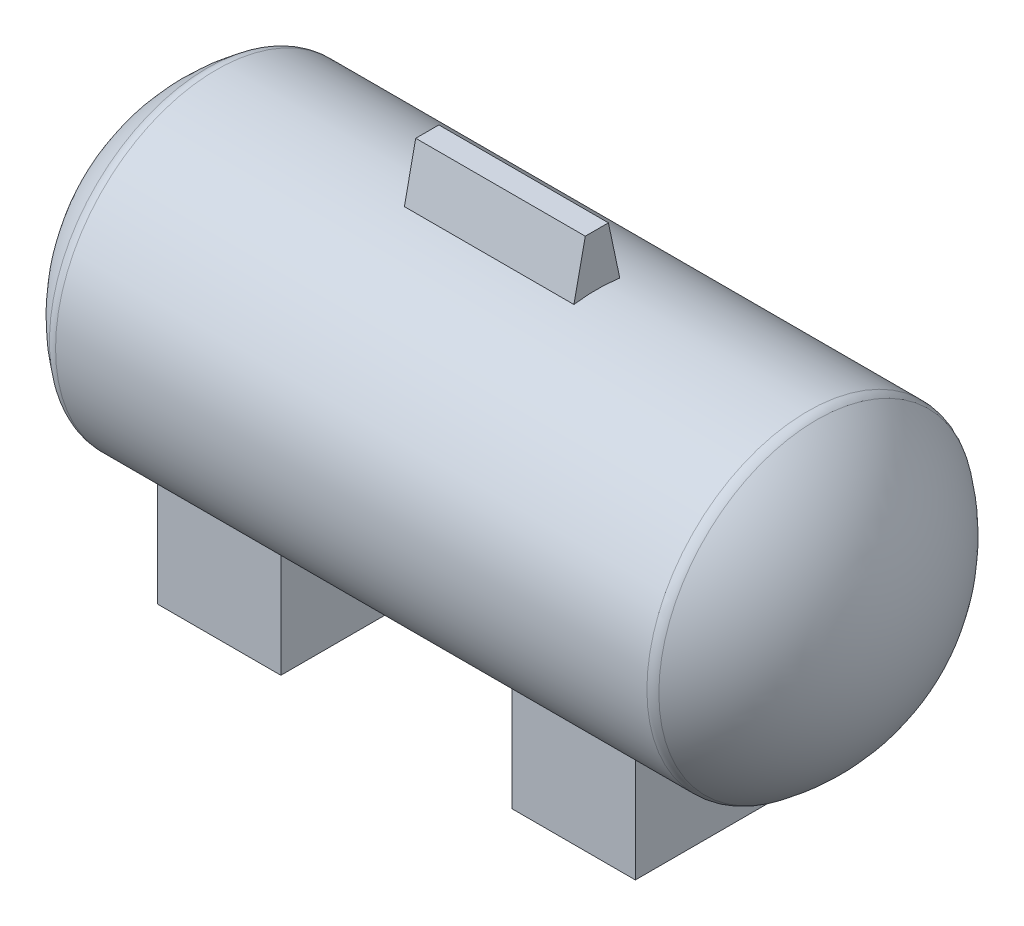
ISO-10303-21;
HEADER;
FILE_DESCRIPTION(('STEP AP214'),'2;1');
FILE_NAME('part.step','',(''),(''),'','','');
FILE_SCHEMA(('AUTOMOTIVE_DESIGN { 1 0 10303 214 1 1 1 1 }'));
ENDSEC;
DATA;
#1=APPLICATION_CONTEXT('core data for automotive mechanical design processes');
#2=APPLICATION_PROTOCOL_DEFINITION('international standard','automotive_design',2000,#1);
#3=PRODUCT_CONTEXT('',#1,'mechanical');
#4=PRODUCT('Part','Part','',(#3));
#5=PRODUCT_RELATED_PRODUCT_CATEGORY('part','',(#4));
#6=PRODUCT_DEFINITION_FORMATION('','',#4);
#7=PRODUCT_DEFINITION_CONTEXT('part definition',#1,'design');
#8=PRODUCT_DEFINITION('design','',#6,#7);
#9=PRODUCT_DEFINITION_SHAPE('','',#8);
#10=(LENGTH_UNIT() NAMED_UNIT(*) SI_UNIT(.MILLI.,.METRE.));
#11=(NAMED_UNIT(*) PLANE_ANGLE_UNIT() SI_UNIT($,.RADIAN.));
#12=(NAMED_UNIT(*) SI_UNIT($,.STERADIAN.) SOLID_ANGLE_UNIT());
#13=UNCERTAINTY_MEASURE_WITH_UNIT(LENGTH_MEASURE(1.E-05),#10,'distance_accuracy_value','');
#14=(GEOMETRIC_REPRESENTATION_CONTEXT(3) GLOBAL_UNCERTAINTY_ASSIGNED_CONTEXT((#13)) GLOBAL_UNIT_ASSIGNED_CONTEXT((#10,
#11,#12)) REPRESENTATION_CONTEXT('',''));
#15=CARTESIAN_POINT('',(0.,0.,0.));
#16=DIRECTION('',(0.,0.,1.));
#17=DIRECTION('',(1.,0.,0.));
#18=AXIS2_PLACEMENT_3D('',#15,#16,#17);
#19=CARTESIAN_POINT('',(-12.3499999999074,0.,0.));
#20=DIRECTION('',(-1.,0.,0.));
#21=DIRECTION('',(0.,1.,0.));
#22=AXIS2_PLACEMENT_3D('',#19,#20,#21);
#23=SPHERICAL_SURFACE('',#22,12.6500000000925);
#24=CARTESIAN_POINT('',(-19.7698130996348,0.,0.));
#25=DIRECTION('',(1.,0.,0.));
#26=DIRECTION('',(0.,0.,-1.));
#27=AXIS2_PLACEMENT_3D('',#24,#25,#26);
#28=CIRCLE('',#27,10.2454318389932);
#29=CARTESIAN_POINT('',(-19.7698130996348,0.,-10.2454318389932));
#30=VERTEX_POINT('',#29);
#31=EDGE_CURVE('E231',#30,#30,#28,.F.);
#32=ORIENTED_EDGE('',*,*,#31,.T.);
#33=EDGE_LOOP('',(#32));
#34=FACE_BOUND('',#33,.T.);
#35=ADVANCED_FACE('F33',(#34),#23,.T.);
#36=CARTESIAN_POINT('',(12.3499999999074,0.,0.));
#37=DIRECTION('',(-1.,0.,0.));
#38=DIRECTION('',(0.,1.,0.));
#39=AXIS2_PLACEMENT_3D('',#36,#37,#38);
#40=SPHERICAL_SURFACE('',#39,12.6500000000925);
#41=CARTESIAN_POINT('',(19.7698130996348,0.,0.));
#42=DIRECTION('',(-1.,0.,0.));
#43=DIRECTION('',(0.,0.,1.));
#44=AXIS2_PLACEMENT_3D('',#41,#42,#43);
#45=CIRCLE('',#44,10.2454318389932);
#46=CARTESIAN_POINT('',(19.7698130996348,0.,10.2454318389932));
#47=VERTEX_POINT('',#46);
#48=EDGE_CURVE('E240',#47,#47,#45,.F.);
#49=ORIENTED_EDGE('',*,*,#48,.T.);
#50=EDGE_LOOP('',(#49));
#51=FACE_BOUND('',#50,.T.);
#52=ADVANCED_FACE('F261',(#51),#40,.T.);
#53=CARTESIAN_POINT('',(-19.5,0.,0.));
#54=DIRECTION('',(-1.,0.,0.));
#55=DIRECTION('',(0.,0.,1.));
#56=AXIS2_PLACEMENT_3D('',#53,#54,#55);
#57=CYLINDRICAL_SURFACE('',#56,10.4355162786044);
#58=DIRECTION('',(-1.,0.,0.));
#59=VECTOR('',#58,1.);
#60=CARTESIAN_POINT('',(-19.5,10.3289421958644,-1.48759978337881));
#61=LINE('',#60,#59);
#62=CARTESIAN_POINT('',(5.5,10.3289421958644,-1.48759978337881));
#63=VERTEX_POINT('',#62);
#64=CARTESIAN_POINT('',(-5.5,10.3289421958644,-1.48759978337881));
#65=VERTEX_POINT('',#64);
#66=EDGE_CURVE('E51',#63,#65,#61,.T.);
#67=ORIENTED_EDGE('',*,*,#66,.F.);
#68=CARTESIAN_POINT('',(5.5,0.,0.));
#69=DIRECTION('',(1.,0.,0.));
#70=DIRECTION('',(0.,0.,-1.));
#71=AXIS2_PLACEMENT_3D('',#68,#69,#70);
#72=CIRCLE('',#71,10.4355162786044);
#73=CARTESIAN_POINT('',(5.5,10.3289421958644,1.48759978337881));
#74=VERTEX_POINT('',#73);
#75=EDGE_CURVE('E11',#63,#74,#72,.T.);
#76=ORIENTED_EDGE('',*,*,#75,.T.);
#77=DIRECTION('',(-1.,0.,0.));
#78=VECTOR('',#77,1.);
#79=CARTESIAN_POINT('',(-19.5,10.3289421958644,1.48759978337881));
#80=LINE('',#79,#78);
#81=CARTESIAN_POINT('',(-5.5,10.3289421958644,1.48759978337881));
#82=VERTEX_POINT('',#81);
#83=EDGE_CURVE('E41',#82,#74,#80,.F.);
#84=ORIENTED_EDGE('',*,*,#83,.F.);
#85=CARTESIAN_POINT('',(-5.5,0.,0.));
#86=DIRECTION('',(1.,0.,0.));
#87=DIRECTION('',(0.,0.,-1.));
#88=AXIS2_PLACEMENT_3D('',#85,#86,#87);
#89=CIRCLE('',#88,10.4355162786044);
#90=EDGE_CURVE('E243',#65,#82,#89,.T.);
#91=ORIENTED_EDGE('',*,*,#90,.F.);
#92=EDGE_LOOP('',(#67,#76,#84,#91));
#93=FACE_BOUND('',#92,.T.);
#94=CARTESIAN_POINT('',(-19.1832666095421,0.,0.));
#95=DIRECTION('',(1.,0.,0.));
#96=DIRECTION('',(0.,0.,-1.));
#97=AXIS2_PLACEMENT_3D('',#94,#95,#96);
#98=CIRCLE('',#97,10.4355162786044);
#99=CARTESIAN_POINT('',(-19.1832666095421,0.,-10.4355162786044));
#100=VERTEX_POINT('',#99);
#101=EDGE_CURVE('E237',#100,#100,#98,.T.);
#102=ORIENTED_EDGE('',*,*,#101,.T.);
#103=EDGE_LOOP('',(#102));
#104=FACE_BOUND('',#103,.T.);
#105=CARTESIAN_POINT('',(19.1832666095421,0.,0.));
#106=DIRECTION('',(-1.,0.,0.));
#107=DIRECTION('',(0.,0.,1.));
#108=AXIS2_PLACEMENT_3D('',#105,#106,#107);
#109=CIRCLE('',#108,10.4355162786044);
#110=CARTESIAN_POINT('',(19.1832666095421,0.,10.4355162786044));
#111=VERTEX_POINT('',#110);
#112=EDGE_CURVE('E234',#111,#111,#109,.T.);
#113=ORIENTED_EDGE('',*,*,#112,.T.);
#114=EDGE_LOOP('',(#113));
#115=FACE_BOUND('',#114,.T.);
#116=DIRECTION('',(-1.,0.,0.));
#117=VECTOR('',#116,1.);
#118=CARTESIAN_POINT('',(-19.5,-7.25603197353883,-7.49999999999999));
#119=LINE('',#118,#117);
#120=CARTESIAN_POINT('',(15.5,-7.25603197353883,-7.5));
#121=VERTEX_POINT('',#120);
#122=CARTESIAN_POINT('',(7.50000000000001,-7.25603197353883,-7.5));
#123=VERTEX_POINT('',#122);
#124=EDGE_CURVE('E225',#121,#123,#119,.T.);
#125=ORIENTED_EDGE('',*,*,#124,.T.);
#126=CARTESIAN_POINT('',(7.50000000000001,0.,0.));
#127=DIRECTION('',(-1.,0.,0.));
#128=DIRECTION('',(0.,0.,1.));
#129=AXIS2_PLACEMENT_3D('',#126,#127,#128);
#130=CIRCLE('',#129,10.4355162786044);
#131=CARTESIAN_POINT('',(7.50000000000001,-7.25603197353882,7.5));
#132=VERTEX_POINT('',#131);
#133=EDGE_CURVE('E228',#123,#132,#130,.T.);
#134=ORIENTED_EDGE('',*,*,#133,.T.);
#135=DIRECTION('',(-1.,0.,0.));
#136=VECTOR('',#135,1.);
#137=CARTESIAN_POINT('',(-19.5,-7.25603197353882,7.5));
#138=LINE('',#137,#136);
#139=CARTESIAN_POINT('',(15.5,-7.25603197353882,7.5));
#140=VERTEX_POINT('',#139);
#141=EDGE_CURVE('E219',#132,#140,#138,.F.);
#142=ORIENTED_EDGE('',*,*,#141,.T.);
#143=CARTESIAN_POINT('',(15.5,0.,0.));
#144=DIRECTION('',(1.,0.,0.));
#145=DIRECTION('',(0.,0.,-1.));
#146=AXIS2_PLACEMENT_3D('',#143,#144,#145);
#147=CIRCLE('',#146,10.4355162786044);
#148=EDGE_CURVE('E222',#140,#121,#147,.T.);
#149=ORIENTED_EDGE('',*,*,#148,.T.);
#150=EDGE_LOOP('',(#125,#134,#142,#149));
#151=FACE_BOUND('',#150,.T.);
#152=DIRECTION('',(-1.,0.,0.));
#153=VECTOR('',#152,1.);
#154=CARTESIAN_POINT('',(-19.5,-7.25603197353882,-7.5));
#155=LINE('',#154,#153);
#156=CARTESIAN_POINT('',(-7.5,-7.25603197353882,-7.5));
#157=VERTEX_POINT('',#156);
#158=CARTESIAN_POINT('',(-15.5,-7.25603197353882,-7.5));
#159=VERTEX_POINT('',#158);
#160=EDGE_CURVE('E213',#157,#159,#155,.T.);
#161=ORIENTED_EDGE('',*,*,#160,.T.);
#162=CARTESIAN_POINT('',(-15.5,0.,0.));
#163=DIRECTION('',(-1.,0.,0.));
#164=DIRECTION('',(0.,0.,1.));
#165=AXIS2_PLACEMENT_3D('',#162,#163,#164);
#166=CIRCLE('',#165,10.4355162786044);
#167=CARTESIAN_POINT('',(-15.5,-7.25603197353883,7.5));
#168=VERTEX_POINT('',#167);
#169=EDGE_CURVE('E216',#159,#168,#166,.T.);
#170=ORIENTED_EDGE('',*,*,#169,.T.);
#171=DIRECTION('',(-1.,0.,0.));
#172=VECTOR('',#171,1.);
#173=CARTESIAN_POINT('',(-19.5,-7.25603197353883,7.5));
#174=LINE('',#173,#172);
#175=CARTESIAN_POINT('',(-7.5,-7.25603197353883,7.5));
#176=VERTEX_POINT('',#175);
#177=EDGE_CURVE('E200',#168,#176,#174,.F.);
#178=ORIENTED_EDGE('',*,*,#177,.T.);
#179=CARTESIAN_POINT('',(-7.5,0.,0.));
#180=DIRECTION('',(1.,0.,0.));
#181=DIRECTION('',(0.,0.,-1.));
#182=AXIS2_PLACEMENT_3D('',#179,#180,#181);
#183=CIRCLE('',#182,10.4355162786044);
#184=EDGE_CURVE('E210',#176,#157,#183,.T.);
#185=ORIENTED_EDGE('',*,*,#184,.T.);
#186=EDGE_LOOP('',(#161,#170,#178,#185));
#187=FACE_BOUND('',#186,.T.);
#188=ADVANCED_FACE('F249',(#93,#104,#115,#151,#187),#57,.T.);
#189=CARTESIAN_POINT('',(-7.5,-14.,-7.5));
#190=DIRECTION('',(0.,0.,-1.));
#191=DIRECTION('',(-1.,0.,0.));
#192=AXIS2_PLACEMENT_3D('',#189,#190,#191);
#193=PLANE('',#192);
#194=ORIENTED_EDGE('',*,*,#160,.F.);
#195=DIRECTION('',(0.,1.,0.));
#196=VECTOR('',#195,1.);
#197=CARTESIAN_POINT('',(-7.5,-14.,-7.5));
#198=LINE('',#197,#196);
#199=CARTESIAN_POINT('',(-7.5,-14.,-7.5));
#200=VERTEX_POINT('',#199);
#201=EDGE_CURVE('E201',#200,#157,#198,.T.);
#202=ORIENTED_EDGE('',*,*,#201,.F.);
#203=DIRECTION('',(-1.,0.,0.));
#204=VECTOR('',#203,1.);
#205=CARTESIAN_POINT('',(-7.5,-14.,-7.5));
#206=LINE('',#205,#204);
#207=CARTESIAN_POINT('',(-15.5,-14.,-7.5));
#208=VERTEX_POINT('',#207);
#209=EDGE_CURVE('E193',#200,#208,#206,.T.);
#210=ORIENTED_EDGE('',*,*,#209,.T.);
#211=DIRECTION('',(0.,1.,0.));
#212=VECTOR('',#211,1.);
#213=CARTESIAN_POINT('',(-15.5,-14.,-7.5));
#214=LINE('',#213,#212);
#215=EDGE_CURVE('E197',#208,#159,#214,.T.);
#216=ORIENTED_EDGE('',*,*,#215,.T.);
#217=EDGE_LOOP('',(#194,#202,#210,#216));
#218=FACE_BOUND('',#217,.T.);
#219=ADVANCED_FACE('F287',(#218),#193,.T.);
#220=CARTESIAN_POINT('',(-7.5,-14.,7.5));
#221=DIRECTION('',(0.,0.,1.));
#222=DIRECTION('',(1.,0.,0.));
#223=AXIS2_PLACEMENT_3D('',#220,#221,#222);
#224=PLANE('',#223);
#225=ORIENTED_EDGE('',*,*,#177,.F.);
#226=DIRECTION('',(0.,1.,0.));
#227=VECTOR('',#226,1.);
#228=CARTESIAN_POINT('',(-15.5,-14.,7.5));
#229=LINE('',#228,#227);
#230=CARTESIAN_POINT('',(-15.5,-14.,7.5));
#231=VERTEX_POINT('',#230);
#232=EDGE_CURVE('E196',#231,#168,#229,.T.);
#233=ORIENTED_EDGE('',*,*,#232,.F.);
#234=DIRECTION('',(1.,0.,0.));
#235=VECTOR('',#234,1.);
#236=CARTESIAN_POINT('',(-7.5,-14.,7.5));
#237=LINE('',#236,#235);
#238=CARTESIAN_POINT('',(-7.5,-14.,7.5));
#239=VERTEX_POINT('',#238);
#240=EDGE_CURVE('E187',#231,#239,#237,.T.);
#241=ORIENTED_EDGE('',*,*,#240,.T.);
#242=DIRECTION('',(0.,1.,0.));
#243=VECTOR('',#242,1.);
#244=CARTESIAN_POINT('',(-7.5,-14.,7.5));
#245=LINE('',#244,#243);
#246=EDGE_CURVE('E204',#239,#176,#245,.T.);
#247=ORIENTED_EDGE('',*,*,#246,.T.);
#248=EDGE_LOOP('',(#225,#233,#241,#247));
#249=FACE_BOUND('',#248,.T.);
#250=ADVANCED_FACE('F304',(#249),#224,.T.);
#251=CARTESIAN_POINT('',(-15.5,-14.,7.5));
#252=DIRECTION('',(-1.,0.,0.));
#253=DIRECTION('',(0.,0.,1.));
#254=AXIS2_PLACEMENT_3D('',#251,#252,#253);
#255=PLANE('',#254);
#256=ORIENTED_EDGE('',*,*,#169,.F.);
#257=ORIENTED_EDGE('',*,*,#215,.F.);
#258=DIRECTION('',(0.,0.,1.));
#259=VECTOR('',#258,1.);
#260=CARTESIAN_POINT('',(-15.5,-14.,7.5));
#261=LINE('',#260,#259);
#262=EDGE_CURVE('E177',#208,#231,#261,.T.);
#263=ORIENTED_EDGE('',*,*,#262,.T.);
#264=ORIENTED_EDGE('',*,*,#232,.T.);
#265=EDGE_LOOP('',(#256,#257,#263,#264));
#266=FACE_BOUND('',#265,.T.);
#267=ADVANCED_FACE('F302',(#266),#255,.T.);
#268=CARTESIAN_POINT('',(-7.5,-14.,7.5));
#269=DIRECTION('',(1.,0.,0.));
#270=DIRECTION('',(0.,0.,-1.));
#271=AXIS2_PLACEMENT_3D('',#268,#269,#270);
#272=PLANE('',#271);
#273=ORIENTED_EDGE('',*,*,#184,.F.);
#274=ORIENTED_EDGE('',*,*,#246,.F.);
#275=DIRECTION('',(0.,0.,-1.));
#276=VECTOR('',#275,1.);
#277=CARTESIAN_POINT('',(-7.5,-14.,7.5));
#278=LINE('',#277,#276);
#279=EDGE_CURVE('E190',#239,#200,#278,.T.);
#280=ORIENTED_EDGE('',*,*,#279,.T.);
#281=ORIENTED_EDGE('',*,*,#201,.T.);
#282=EDGE_LOOP('',(#273,#274,#280,#281));
#283=FACE_BOUND('',#282,.T.);
#284=ADVANCED_FACE('F294',(#283),#272,.T.);
#285=CARTESIAN_POINT('',(0.,-14.,0.));
#286=DIRECTION('',(0.,1.,0.));
#287=DIRECTION('',(0.,0.,1.));
#288=AXIS2_PLACEMENT_3D('',#285,#286,#287);
#289=PLANE('',#288);
#290=CARTESIAN_POINT('',(-11.5,-14.,0.));
#291=DIRECTION('',(0.,-1.,0.));
#292=DIRECTION('',(0.,0.,-1.));
#293=AXIS2_PLACEMENT_3D('',#290,#291,#292);
#294=CIRCLE('',#293,1.5);
#295=CARTESIAN_POINT('',(-11.5,-14.,-1.5));
#296=VERTEX_POINT('',#295);
#297=EDGE_CURVE('E134',#296,#296,#294,.T.);
#298=ORIENTED_EDGE('',*,*,#297,.F.);
#299=EDGE_LOOP('',(#298));
#300=FACE_BOUND('',#299,.T.);
#301=ORIENTED_EDGE('',*,*,#262,.F.);
#302=ORIENTED_EDGE('',*,*,#209,.F.);
#303=ORIENTED_EDGE('',*,*,#279,.F.);
#304=ORIENTED_EDGE('',*,*,#240,.F.);
#305=EDGE_LOOP('',(#301,#302,#303,#304));
#306=FACE_BOUND('',#305,.T.);
#307=ADVANCED_FACE('F300',(#300,#306),#289,.F.);
#308=CARTESIAN_POINT('',(15.5,-14.,-7.5));
#309=DIRECTION('',(0.,0.,-1.));
#310=DIRECTION('',(-1.,0.,0.));
#311=AXIS2_PLACEMENT_3D('',#308,#309,#310);
#312=PLANE('',#311);
#313=ORIENTED_EDGE('',*,*,#124,.F.);
#314=DIRECTION('',(0.,1.,0.));
#315=VECTOR('',#314,1.);
#316=CARTESIAN_POINT('',(15.5,-14.,-7.5));
#317=LINE('',#316,#315);
#318=CARTESIAN_POINT('',(15.5,-14.,-7.5));
#319=VERTEX_POINT('',#318);
#320=EDGE_CURVE('E178',#319,#121,#317,.T.);
#321=ORIENTED_EDGE('',*,*,#320,.F.);
#322=DIRECTION('',(-1.,0.,0.));
#323=VECTOR('',#322,1.);
#324=CARTESIAN_POINT('',(15.5,-14.,-7.5));
#325=LINE('',#324,#323);
#326=CARTESIAN_POINT('',(7.50000000000001,-14.,-7.5));
#327=VERTEX_POINT('',#326);
#328=EDGE_CURVE('E170',#319,#327,#325,.T.);
#329=ORIENTED_EDGE('',*,*,#328,.T.);
#330=DIRECTION('',(0.,1.,0.));
#331=VECTOR('',#330,1.);
#332=CARTESIAN_POINT('',(7.50000000000001,-14.,-7.5));
#333=LINE('',#332,#331);
#334=EDGE_CURVE('E174',#327,#123,#333,.T.);
#335=ORIENTED_EDGE('',*,*,#334,.T.);
#336=EDGE_LOOP('',(#313,#321,#329,#335));
#337=FACE_BOUND('',#336,.T.);
#338=ADVANCED_FACE('F318',(#337),#312,.T.);
#339=CARTESIAN_POINT('',(15.5,-14.,7.5));
#340=DIRECTION('',(0.,0.,1.));
#341=DIRECTION('',(1.,0.,0.));
#342=AXIS2_PLACEMENT_3D('',#339,#340,#341);
#343=PLANE('',#342);
#344=ORIENTED_EDGE('',*,*,#141,.F.);
#345=DIRECTION('',(0.,1.,0.));
#346=VECTOR('',#345,1.);
#347=CARTESIAN_POINT('',(7.50000000000001,-14.,7.5));
#348=LINE('',#347,#346);
#349=CARTESIAN_POINT('',(7.50000000000001,-14.,7.5));
#350=VERTEX_POINT('',#349);
#351=EDGE_CURVE('E173',#350,#132,#348,.T.);
#352=ORIENTED_EDGE('',*,*,#351,.F.);
#353=DIRECTION('',(1.,0.,0.));
#354=VECTOR('',#353,1.);
#355=CARTESIAN_POINT('',(15.5,-14.,7.5));
#356=LINE('',#355,#354);
#357=CARTESIAN_POINT('',(15.5,-14.,7.5));
#358=VERTEX_POINT('',#357);
#359=EDGE_CURVE('E164',#350,#358,#356,.T.);
#360=ORIENTED_EDGE('',*,*,#359,.T.);
#361=DIRECTION('',(0.,1.,0.));
#362=VECTOR('',#361,1.);
#363=CARTESIAN_POINT('',(15.5,-14.,7.5));
#364=LINE('',#363,#362);
#365=EDGE_CURVE('E181',#358,#140,#364,.T.);
#366=ORIENTED_EDGE('',*,*,#365,.T.);
#367=EDGE_LOOP('',(#344,#352,#360,#366));
#368=FACE_BOUND('',#367,.T.);
#369=ADVANCED_FACE('F324',(#368),#343,.T.);
#370=CARTESIAN_POINT('',(7.50000000000001,-14.,7.5));
#371=DIRECTION('',(-1.,0.,0.));
#372=DIRECTION('',(0.,0.,1.));
#373=AXIS2_PLACEMENT_3D('',#370,#371,#372);
#374=PLANE('',#373);
#375=ORIENTED_EDGE('',*,*,#133,.F.);
#376=ORIENTED_EDGE('',*,*,#334,.F.);
#377=DIRECTION('',(0.,0.,1.));
#378=VECTOR('',#377,1.);
#379=CARTESIAN_POINT('',(7.50000000000001,-14.,7.5));
#380=LINE('',#379,#378);
#381=EDGE_CURVE('E153',#327,#350,#380,.T.);
#382=ORIENTED_EDGE('',*,*,#381,.T.);
#383=ORIENTED_EDGE('',*,*,#351,.T.);
#384=EDGE_LOOP('',(#375,#376,#382,#383));
#385=FACE_BOUND('',#384,.T.);
#386=ADVANCED_FACE('F320',(#385),#374,.T.);
#387=CARTESIAN_POINT('',(15.5,-14.,7.5));
#388=DIRECTION('',(1.,0.,0.));
#389=DIRECTION('',(0.,0.,-1.));
#390=AXIS2_PLACEMENT_3D('',#387,#388,#389);
#391=PLANE('',#390);
#392=ORIENTED_EDGE('',*,*,#148,.F.);
#393=ORIENTED_EDGE('',*,*,#365,.F.);
#394=DIRECTION('',(0.,0.,-1.));
#395=VECTOR('',#394,1.);
#396=CARTESIAN_POINT('',(15.5,-14.,7.5));
#397=LINE('',#396,#395);
#398=EDGE_CURVE('E167',#358,#319,#397,.T.);
#399=ORIENTED_EDGE('',*,*,#398,.T.);
#400=ORIENTED_EDGE('',*,*,#320,.T.);
#401=EDGE_LOOP('',(#392,#393,#399,#400));
#402=FACE_BOUND('',#401,.T.);
#403=ADVANCED_FACE('F323',(#402),#391,.T.);
#404=CARTESIAN_POINT('',(0.,-14.,0.));
#405=DIRECTION('',(0.,1.,0.));
#406=DIRECTION('',(0.,0.,1.));
#407=AXIS2_PLACEMENT_3D('',#404,#405,#406);
#408=PLANE('',#407);
#409=CARTESIAN_POINT('',(11.5,-14.,0.));
#410=DIRECTION('',(0.,-1.,0.));
#411=DIRECTION('',(0.,0.,-1.));
#412=AXIS2_PLACEMENT_3D('',#409,#410,#411);
#413=CIRCLE('',#412,1.5);
#414=CARTESIAN_POINT('',(11.5,-14.,-1.5));
#415=VERTEX_POINT('',#414);
#416=EDGE_CURVE('E154',#415,#415,#413,.T.);
#417=ORIENTED_EDGE('',*,*,#416,.F.);
#418=EDGE_LOOP('',(#417));
#419=FACE_BOUND('',#418,.T.);
#420=ORIENTED_EDGE('',*,*,#381,.F.);
#421=ORIENTED_EDGE('',*,*,#328,.F.);
#422=ORIENTED_EDGE('',*,*,#398,.F.);
#423=ORIENTED_EDGE('',*,*,#359,.F.);
#424=EDGE_LOOP('',(#420,#421,#422,#423));
#425=FACE_BOUND('',#424,.T.);
#426=ADVANCED_FACE('F331',(#419,#425),#408,.F.);
#427=CARTESIAN_POINT('',(11.5,-4.,0.));
#428=DIRECTION('',(0.,-1.,0.));
#429=DIRECTION('',(0.,0.,-1.));
#430=AXIS2_PLACEMENT_3D('',#427,#428,#429);
#431=CYLINDRICAL_SURFACE('',#430,1.5);
#432=CARTESIAN_POINT('',(11.5,-4.,0.));
#433=DIRECTION('',(0.,-1.,0.));
#434=DIRECTION('',(0.,0.,-1.));
#435=AXIS2_PLACEMENT_3D('',#432,#433,#434);
#436=CIRCLE('',#435,1.5);
#437=CARTESIAN_POINT('',(11.5,-4.,-1.5));
#438=VERTEX_POINT('',#437);
#439=EDGE_CURVE('E150',#438,#438,#436,.T.);
#440=ORIENTED_EDGE('',*,*,#439,.F.);
#441=EDGE_LOOP('',(#440));
#442=FACE_BOUND('',#441,.T.);
#443=ORIENTED_EDGE('',*,*,#416,.T.);
#444=EDGE_LOOP('',(#443));
#445=FACE_BOUND('',#444,.T.);
#446=ADVANCED_FACE('F338',(#442,#445),#431,.F.);
#447=CARTESIAN_POINT('',(11.5,-4.,0.));
#448=DIRECTION('',(0.,-1.,0.));
#449=DIRECTION('',(0.,0.,-1.));
#450=AXIS2_PLACEMENT_3D('',#447,#448,#449);
#451=PLANE('',#450);
#452=ORIENTED_EDGE('',*,*,#439,.T.);
#453=EDGE_LOOP('',(#452));
#454=FACE_BOUND('',#453,.T.);
#455=ADVANCED_FACE('F341',(#454),#451,.T.);
#456=CARTESIAN_POINT('',(-11.5,-4.,0.));
#457=DIRECTION('',(0.,-1.,0.));
#458=DIRECTION('',(0.,0.,-1.));
#459=AXIS2_PLACEMENT_3D('',#456,#457,#458);
#460=CYLINDRICAL_SURFACE('',#459,1.5);
#461=CARTESIAN_POINT('',(-11.5,-4.,0.));
#462=DIRECTION('',(0.,-1.,0.));
#463=DIRECTION('',(0.,0.,-1.));
#464=AXIS2_PLACEMENT_3D('',#461,#462,#463);
#465=CIRCLE('',#464,1.5);
#466=CARTESIAN_POINT('',(-11.5,-4.,-1.5));
#467=VERTEX_POINT('',#466);
#468=EDGE_CURVE('E157',#467,#467,#465,.T.);
#469=ORIENTED_EDGE('',*,*,#468,.F.);
#470=EDGE_LOOP('',(#469));
#471=FACE_BOUND('',#470,.T.);
#472=ORIENTED_EDGE('',*,*,#297,.T.);
#473=EDGE_LOOP('',(#472));
#474=FACE_BOUND('',#473,.T.);
#475=ADVANCED_FACE('F279',(#471,#474),#460,.F.);
#476=CARTESIAN_POINT('',(-11.5,-4.,0.));
#477=DIRECTION('',(0.,-1.,0.));
#478=DIRECTION('',(0.,0.,-1.));
#479=AXIS2_PLACEMENT_3D('',#476,#477,#478);
#480=PLANE('',#479);
#481=ORIENTED_EDGE('',*,*,#468,.T.);
#482=EDGE_LOOP('',(#481));
#483=FACE_BOUND('',#482,.T.);
#484=ADVANCED_FACE('F272',(#483),#480,.T.);
#485=CARTESIAN_POINT('',(-19.1832666095421,0.,0.));
#486=DIRECTION('',(1.,0.,0.));
#487=DIRECTION('',(0.,0.,-1.));
#488=AXIS2_PLACEMENT_3D('',#485,#486,#487);
#489=TOROIDAL_SURFACE('',#488,9.43551627860442,1.);
#490=ORIENTED_EDGE('',*,*,#101,.F.);
#491=EDGE_LOOP('',(#490));
#492=FACE_BOUND('',#491,.T.);
#493=ORIENTED_EDGE('',*,*,#31,.F.);
#494=EDGE_LOOP('',(#493));
#495=FACE_BOUND('',#494,.T.);
#496=ADVANCED_FACE('F270',(#492,#495),#489,.T.);
#497=CARTESIAN_POINT('',(19.1832666095421,0.,0.));
#498=DIRECTION('',(-1.,0.,0.));
#499=DIRECTION('',(0.,0.,1.));
#500=AXIS2_PLACEMENT_3D('',#497,#498,#499);
#501=TOROIDAL_SURFACE('',#500,9.43551627860442,1.);
#502=ORIENTED_EDGE('',*,*,#48,.F.);
#503=EDGE_LOOP('',(#502));
#504=FACE_BOUND('',#503,.T.);
#505=ORIENTED_EDGE('',*,*,#112,.F.);
#506=EDGE_LOOP('',(#505));
#507=FACE_BOUND('',#506,.T.);
#508=ADVANCED_FACE('F35',(#504,#507),#501,.T.);
#509=CARTESIAN_POINT('',(5.5,13.8,0.75));
#510=DIRECTION('',(0.,-0.207858755820045,-0.978158850917857));
#511=DIRECTION('',(0.,0.978158850917857,-0.207858755820045));
#512=AXIS2_PLACEMENT_3D('',#509,#510,#511);
#513=PLANE('',#512);
#514=DIRECTION('',(0.,-0.978158850917857,0.207858755820045));
#515=VECTOR('',#514,1.);
#516=CARTESIAN_POINT('',(-5.5,13.8,0.75));
#517=LINE('',#516,#515);
#518=CARTESIAN_POINT('',(-5.5,13.8,0.75));
#519=VERTEX_POINT('',#518);
#520=EDGE_CURVE('E144',#519,#82,#517,.T.);
#521=ORIENTED_EDGE('',*,*,#520,.T.);
#522=ORIENTED_EDGE('',*,*,#83,.T.);
#523=DIRECTION('',(0.,-0.978158850917857,0.207858755820045));
#524=VECTOR('',#523,1.);
#525=CARTESIAN_POINT('',(5.5,13.8,0.75));
#526=LINE('',#525,#524);
#527=CARTESIAN_POINT('',(5.5,13.8,0.75));
#528=VERTEX_POINT('',#527);
#529=EDGE_CURVE('E125',#528,#74,#526,.T.);
#530=ORIENTED_EDGE('',*,*,#529,.F.);
#531=DIRECTION('',(-1.,0.,0.));
#532=VECTOR('',#531,1.);
#533=CARTESIAN_POINT('',(5.5,13.8,0.75));
#534=LINE('',#533,#532);
#535=EDGE_CURVE('E135',#528,#519,#534,.T.);
#536=ORIENTED_EDGE('',*,*,#535,.T.);
#537=EDGE_LOOP('',(#521,#522,#530,#536));
#538=FACE_BOUND('',#537,.T.);
#539=ADVANCED_FACE('F247',(#538),#513,.F.);
#540=CARTESIAN_POINT('',(5.5,9.8,-1.6));
#541=DIRECTION('',(0.,-0.207858755820045,0.978158850917857));
#542=DIRECTION('',(0.,-0.978158850917857,-0.207858755820045));
#543=AXIS2_PLACEMENT_3D('',#540,#541,#542);
#544=PLANE('',#543);
#545=DIRECTION('',(0.,0.978158850917857,0.207858755820045));
#546=VECTOR('',#545,1.);
#547=CARTESIAN_POINT('',(5.5,9.8,-1.6));
#548=LINE('',#547,#546);
#549=CARTESIAN_POINT('',(5.5,13.8,-0.75));
#550=VERTEX_POINT('',#549);
#551=EDGE_CURVE('E117',#63,#550,#548,.T.);
#552=ORIENTED_EDGE('',*,*,#551,.F.);
#553=ORIENTED_EDGE('',*,*,#66,.T.);
#554=DIRECTION('',(0.,0.978158850917857,0.207858755820045));
#555=VECTOR('',#554,1.);
#556=CARTESIAN_POINT('',(-5.5,9.8,-1.6));
#557=LINE('',#556,#555);
#558=CARTESIAN_POINT('',(-5.5,13.8,-0.75));
#559=VERTEX_POINT('',#558);
#560=EDGE_CURVE('E131',#65,#559,#557,.T.);
#561=ORIENTED_EDGE('',*,*,#560,.T.);
#562=DIRECTION('',(-1.,0.,0.));
#563=VECTOR('',#562,1.);
#564=CARTESIAN_POINT('',(5.5,13.8,-0.75));
#565=LINE('',#564,#563);
#566=EDGE_CURVE('E128',#550,#559,#565,.T.);
#567=ORIENTED_EDGE('',*,*,#566,.F.);
#568=EDGE_LOOP('',(#552,#553,#561,#567));
#569=FACE_BOUND('',#568,.T.);
#570=ADVANCED_FACE('F129',(#569),#544,.F.);
#571=CARTESIAN_POINT('',(5.5,13.8,-0.75));
#572=DIRECTION('',(0.,-1.,0.));
#573=DIRECTION('',(0.,0.,-1.));
#574=AXIS2_PLACEMENT_3D('',#571,#572,#573);
#575=PLANE('',#574);
#576=DIRECTION('',(0.,0.,1.));
#577=VECTOR('',#576,1.);
#578=CARTESIAN_POINT('',(-5.5,13.8,-0.75));
#579=LINE('',#578,#577);
#580=EDGE_CURVE('E148',#559,#519,#579,.T.);
#581=ORIENTED_EDGE('',*,*,#580,.T.);
#582=ORIENTED_EDGE('',*,*,#535,.F.);
#583=DIRECTION('',(0.,0.,1.));
#584=VECTOR('',#583,1.);
#585=CARTESIAN_POINT('',(5.5,13.8,-0.75));
#586=LINE('',#585,#584);
#587=EDGE_CURVE('E122',#550,#528,#586,.T.);
#588=ORIENTED_EDGE('',*,*,#587,.F.);
#589=ORIENTED_EDGE('',*,*,#566,.T.);
#590=EDGE_LOOP('',(#581,#582,#588,#589));
#591=FACE_BOUND('',#590,.T.);
#592=ADVANCED_FACE('F137',(#591),#575,.F.);
#593=CARTESIAN_POINT('',(5.5,0.,0.));
#594=DIRECTION('',(1.,0.,0.));
#595=DIRECTION('',(0.,0.,-1.));
#596=AXIS2_PLACEMENT_3D('',#593,#594,#595);
#597=PLANE('',#596);
#598=ORIENTED_EDGE('',*,*,#75,.F.);
#599=ORIENTED_EDGE('',*,*,#551,.T.);
#600=ORIENTED_EDGE('',*,*,#587,.T.);
#601=ORIENTED_EDGE('',*,*,#529,.T.);
#602=EDGE_LOOP('',(#598,#599,#600,#601));
#603=FACE_BOUND('',#602,.T.);
#604=ADVANCED_FACE('F119',(#603),#597,.T.);
#605=CARTESIAN_POINT('',(-5.5,0.,0.));
#606=DIRECTION('',(1.,0.,0.));
#607=DIRECTION('',(0.,0.,-1.));
#608=AXIS2_PLACEMENT_3D('',#605,#606,#607);
#609=PLANE('',#608);
#610=ORIENTED_EDGE('',*,*,#560,.F.);
#611=ORIENTED_EDGE('',*,*,#90,.T.);
#612=ORIENTED_EDGE('',*,*,#520,.F.);
#613=ORIENTED_EDGE('',*,*,#580,.F.);
#614=EDGE_LOOP('',(#610,#611,#612,#613));
#615=FACE_BOUND('',#614,.T.);
#616=ADVANCED_FACE('F252',(#615),#609,.F.);
#617=CLOSED_SHELL('',(#35,#52,#188,#219,#250,#267,#284,#307,#338,#369,#386,#403,#426,#446,#455,
#475,#484,#496,#508,#539,#570,#592,#604,#616));
#618=MANIFOLD_SOLID_BREP('B2',#617);
#619=ADVANCED_BREP_SHAPE_REPRESENTATION('',(#18,#618),#14);
#620=SHAPE_DEFINITION_REPRESENTATION(#9,#619);
ENDSEC;
END-ISO-10303-21;
